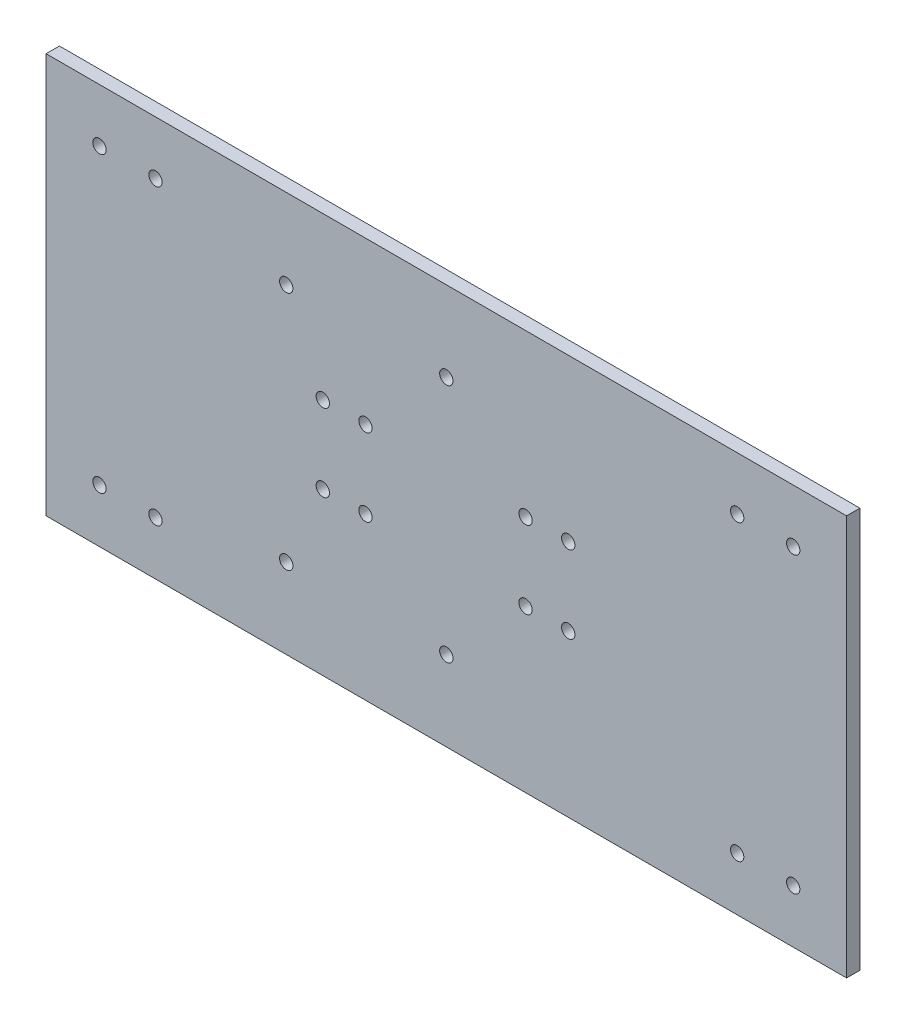
ISO-10303-21;
HEADER;
FILE_DESCRIPTION(('STEP AP214'),'2;1');
FILE_NAME('part.step','',(''),(''),'','','');
FILE_SCHEMA(('AUTOMOTIVE_DESIGN { 1 0 10303 214 1 1 1 1 }'));
ENDSEC;
DATA;
#1=APPLICATION_CONTEXT('core data for automotive mechanical design processes');
#2=APPLICATION_PROTOCOL_DEFINITION('international standard','automotive_design',2000,#1);
#3=PRODUCT_CONTEXT('',#1,'mechanical');
#4=PRODUCT('Part','Part','',(#3));
#5=PRODUCT_RELATED_PRODUCT_CATEGORY('part','',(#4));
#6=PRODUCT_DEFINITION_FORMATION('','',#4);
#7=PRODUCT_DEFINITION_CONTEXT('part definition',#1,'design');
#8=PRODUCT_DEFINITION('design','',#6,#7);
#9=PRODUCT_DEFINITION_SHAPE('','',#8);
#10=(LENGTH_UNIT() NAMED_UNIT(*) SI_UNIT(.MILLI.,.METRE.));
#11=(NAMED_UNIT(*) PLANE_ANGLE_UNIT() SI_UNIT($,.RADIAN.));
#12=(NAMED_UNIT(*) SI_UNIT($,.STERADIAN.) SOLID_ANGLE_UNIT());
#13=UNCERTAINTY_MEASURE_WITH_UNIT(LENGTH_MEASURE(1.E-05),#10,'distance_accuracy_value','');
#14=(GEOMETRIC_REPRESENTATION_CONTEXT(3) GLOBAL_UNCERTAINTY_ASSIGNED_CONTEXT((#13)) GLOBAL_UNIT_ASSIGNED_CONTEXT((#10,
#11,#12)) REPRESENTATION_CONTEXT('',''));
#15=CARTESIAN_POINT('',(0.,0.,0.));
#16=DIRECTION('',(0.,0.,1.));
#17=DIRECTION('',(1.,0.,0.));
#18=AXIS2_PLACEMENT_3D('',#15,#16,#17);
#19=CARTESIAN_POINT('',(0.,0.,5.));
#20=DIRECTION('',(0.,0.,-1.));
#21=DIRECTION('',(-1.,0.,0.));
#22=AXIS2_PLACEMENT_3D('',#19,#20,#21);
#23=PLANE('',#22);
#24=DIRECTION('',(0.,-1.,0.));
#25=VECTOR('',#24,1.);
#26=CARTESIAN_POINT('',(0.,0.,5.));
#27=LINE('',#26,#25);
#28=CARTESIAN_POINT('',(0.,150.,5.));
#29=VERTEX_POINT('',#28);
#30=CARTESIAN_POINT('',(0.,0.,5.));
#31=VERTEX_POINT('',#30);
#32=EDGE_CURVE('E85',#29,#31,#27,.T.);
#33=ORIENTED_EDGE('',*,*,#32,.T.);
#34=DIRECTION('',(1.,0.,0.));
#35=VECTOR('',#34,1.);
#36=CARTESIAN_POINT('',(0.,0.,5.));
#37=LINE('',#36,#35);
#38=CARTESIAN_POINT('',(300.,0.,5.));
#39=VERTEX_POINT('',#38);
#40=EDGE_CURVE('E80',#31,#39,#37,.T.);
#41=ORIENTED_EDGE('',*,*,#40,.T.);
#42=DIRECTION('',(0.,1.,0.));
#43=VECTOR('',#42,1.);
#44=CARTESIAN_POINT('',(300.,0.,5.));
#45=LINE('',#44,#43);
#46=CARTESIAN_POINT('',(300.,150.,5.));
#47=VERTEX_POINT('',#46);
#48=EDGE_CURVE('E83',#39,#47,#45,.T.);
#49=ORIENTED_EDGE('',*,*,#48,.T.);
#50=DIRECTION('',(-1.,0.,0.));
#51=VECTOR('',#50,1.);
#52=CARTESIAN_POINT('',(0.,150.,5.));
#53=LINE('',#52,#51);
#54=EDGE_CURVE('E50',#47,#29,#53,.T.);
#55=ORIENTED_EDGE('',*,*,#54,.T.);
#56=EDGE_LOOP('',(#33,#41,#49,#55));
#57=FACE_BOUND('',#56,.T.);
#58=CARTESIAN_POINT('',(150.,30.,5.));
#59=DIRECTION('',(0.,0.,1.));
#60=DIRECTION('',(1.,0.,0.));
#61=AXIS2_PLACEMENT_3D('',#58,#59,#60);
#62=CIRCLE('',#61,2.5);
#63=CARTESIAN_POINT('',(152.5,30.,5.));
#64=VERTEX_POINT('',#63);
#65=EDGE_CURVE('E100',#64,#64,#62,.T.);
#66=ORIENTED_EDGE('',*,*,#65,.F.);
#67=EDGE_LOOP('',(#66));
#68=FACE_BOUND('',#67,.T.);
#69=CARTESIAN_POINT('',(150.,120.,5.));
#70=DIRECTION('',(0.,0.,1.));
#71=DIRECTION('',(1.,0.,0.));
#72=AXIS2_PLACEMENT_3D('',#69,#70,#71);
#73=CIRCLE('',#72,2.5);
#74=CARTESIAN_POINT('',(152.5,120.,5.));
#75=VERTEX_POINT('',#74);
#76=EDGE_CURVE('E115',#75,#75,#73,.T.);
#77=ORIENTED_EDGE('',*,*,#76,.F.);
#78=EDGE_LOOP('',(#77));
#79=FACE_BOUND('',#78,.T.);
#80=CARTESIAN_POINT('',(103.7,89.5,5.));
#81=DIRECTION('',(0.,0.,1.));
#82=DIRECTION('',(1.,0.,0.));
#83=AXIS2_PLACEMENT_3D('',#80,#81,#82);
#84=CIRCLE('',#83,2.50000000000001);
#85=CARTESIAN_POINT('',(106.2,89.5,5.));
#86=VERTEX_POINT('',#85);
#87=EDGE_CURVE('E121',#86,#86,#84,.T.);
#88=ORIENTED_EDGE('',*,*,#87,.F.);
#89=EDGE_LOOP('',(#88));
#90=FACE_BOUND('',#89,.T.);
#91=CARTESIAN_POINT('',(103.7,60.5,5.));
#92=DIRECTION('',(0.,0.,1.));
#93=DIRECTION('',(1.,0.,0.));
#94=AXIS2_PLACEMENT_3D('',#91,#92,#93);
#95=CIRCLE('',#94,2.50000000000001);
#96=CARTESIAN_POINT('',(106.2,60.5,5.));
#97=VERTEX_POINT('',#96);
#98=EDGE_CURVE('E127',#97,#97,#95,.T.);
#99=ORIENTED_EDGE('',*,*,#98,.F.);
#100=EDGE_LOOP('',(#99));
#101=FACE_BOUND('',#100,.T.);
#102=CARTESIAN_POINT('',(119.7,89.5,5.));
#103=DIRECTION('',(0.,0.,1.));
#104=DIRECTION('',(1.,0.,0.));
#105=AXIS2_PLACEMENT_3D('',#102,#103,#104);
#106=CIRCLE('',#105,2.5);
#107=CARTESIAN_POINT('',(122.2,89.5,5.));
#108=VERTEX_POINT('',#107);
#109=EDGE_CURVE('E133',#108,#108,#106,.T.);
#110=ORIENTED_EDGE('',*,*,#109,.F.);
#111=EDGE_LOOP('',(#110));
#112=FACE_BOUND('',#111,.T.);
#113=CARTESIAN_POINT('',(119.7,60.5,5.));
#114=DIRECTION('',(0.,0.,1.));
#115=DIRECTION('',(1.,0.,0.));
#116=AXIS2_PLACEMENT_3D('',#113,#114,#115);
#117=CIRCLE('',#116,2.5);
#118=CARTESIAN_POINT('',(122.2,60.5,5.));
#119=VERTEX_POINT('',#118);
#120=EDGE_CURVE('E139',#119,#119,#117,.T.);
#121=ORIENTED_EDGE('',*,*,#120,.F.);
#122=EDGE_LOOP('',(#121));
#123=FACE_BOUND('',#122,.T.);
#124=CARTESIAN_POINT('',(90.,120.,5.));
#125=DIRECTION('',(0.,0.,1.));
#126=DIRECTION('',(1.,0.,0.));
#127=AXIS2_PLACEMENT_3D('',#124,#125,#126);
#128=CIRCLE('',#127,2.5);
#129=CARTESIAN_POINT('',(92.5,120.,5.));
#130=VERTEX_POINT('',#129);
#131=EDGE_CURVE('E145',#130,#130,#128,.T.);
#132=ORIENTED_EDGE('',*,*,#131,.F.);
#133=EDGE_LOOP('',(#132));
#134=FACE_BOUND('',#133,.T.);
#135=CARTESIAN_POINT('',(90.,30.,5.));
#136=DIRECTION('',(0.,0.,1.));
#137=DIRECTION('',(1.,0.,0.));
#138=AXIS2_PLACEMENT_3D('',#135,#136,#137);
#139=CIRCLE('',#138,2.5);
#140=CARTESIAN_POINT('',(92.5,30.,5.));
#141=VERTEX_POINT('',#140);
#142=EDGE_CURVE('E151',#141,#141,#139,.T.);
#143=ORIENTED_EDGE('',*,*,#142,.F.);
#144=EDGE_LOOP('',(#143));
#145=FACE_BOUND('',#144,.T.);
#146=CARTESIAN_POINT('',(179.7,89.5,5.));
#147=DIRECTION('',(0.,0.,1.));
#148=DIRECTION('',(1.,0.,0.));
#149=AXIS2_PLACEMENT_3D('',#146,#147,#148);
#150=CIRCLE('',#149,2.50000000000002);
#151=CARTESIAN_POINT('',(182.2,89.5,5.));
#152=VERTEX_POINT('',#151);
#153=EDGE_CURVE('E157',#152,#152,#150,.T.);
#154=ORIENTED_EDGE('',*,*,#153,.F.);
#155=EDGE_LOOP('',(#154));
#156=FACE_BOUND('',#155,.T.);
#157=CARTESIAN_POINT('',(195.7,60.5,5.));
#158=DIRECTION('',(0.,0.,1.));
#159=DIRECTION('',(1.,0.,0.));
#160=AXIS2_PLACEMENT_3D('',#157,#158,#159);
#161=CIRCLE('',#160,2.5);
#162=CARTESIAN_POINT('',(198.2,60.5,5.));
#163=VERTEX_POINT('',#162);
#164=EDGE_CURVE('E163',#163,#163,#161,.T.);
#165=ORIENTED_EDGE('',*,*,#164,.F.);
#166=EDGE_LOOP('',(#165));
#167=FACE_BOUND('',#166,.T.);
#168=CARTESIAN_POINT('',(195.7,89.5,5.));
#169=DIRECTION('',(0.,0.,1.));
#170=DIRECTION('',(1.,0.,0.));
#171=AXIS2_PLACEMENT_3D('',#168,#169,#170);
#172=CIRCLE('',#171,2.49999999999997);
#173=CARTESIAN_POINT('',(198.2,89.5,5.));
#174=VERTEX_POINT('',#173);
#175=EDGE_CURVE('E169',#174,#174,#172,.T.);
#176=ORIENTED_EDGE('',*,*,#175,.F.);
#177=EDGE_LOOP('',(#176));
#178=FACE_BOUND('',#177,.T.);
#179=CARTESIAN_POINT('',(179.7,60.5,5.));
#180=DIRECTION('',(0.,0.,1.));
#181=DIRECTION('',(1.,0.,0.));
#182=AXIS2_PLACEMENT_3D('',#179,#180,#181);
#183=CIRCLE('',#182,2.50000000000002);
#184=CARTESIAN_POINT('',(182.2,60.5,5.));
#185=VERTEX_POINT('',#184);
#186=EDGE_CURVE('E175',#185,#185,#183,.T.);
#187=ORIENTED_EDGE('',*,*,#186,.F.);
#188=EDGE_LOOP('',(#187));
#189=FACE_BOUND('',#188,.T.);
#190=CARTESIAN_POINT('',(20.,130.,5.));
#191=DIRECTION('',(0.,0.,1.));
#192=DIRECTION('',(1.,0.,0.));
#193=AXIS2_PLACEMENT_3D('',#190,#191,#192);
#194=CIRCLE('',#193,2.5);
#195=CARTESIAN_POINT('',(22.5,130.,5.));
#196=VERTEX_POINT('',#195);
#197=EDGE_CURVE('E181',#196,#196,#194,.T.);
#198=ORIENTED_EDGE('',*,*,#197,.F.);
#199=EDGE_LOOP('',(#198));
#200=FACE_BOUND('',#199,.T.);
#201=CARTESIAN_POINT('',(41.,130.,5.));
#202=DIRECTION('',(0.,0.,1.));
#203=DIRECTION('',(1.,0.,0.));
#204=AXIS2_PLACEMENT_3D('',#201,#202,#203);
#205=CIRCLE('',#204,2.5);
#206=CARTESIAN_POINT('',(43.5,130.,5.));
#207=VERTEX_POINT('',#206);
#208=EDGE_CURVE('E187',#207,#207,#205,.T.);
#209=ORIENTED_EDGE('',*,*,#208,.F.);
#210=EDGE_LOOP('',(#209));
#211=FACE_BOUND('',#210,.T.);
#212=CARTESIAN_POINT('',(259.,130.,5.));
#213=DIRECTION('',(0.,0.,1.));
#214=DIRECTION('',(1.,0.,0.));
#215=AXIS2_PLACEMENT_3D('',#212,#213,#214);
#216=CIRCLE('',#215,2.50000000000002);
#217=CARTESIAN_POINT('',(261.5,130.,5.));
#218=VERTEX_POINT('',#217);
#219=EDGE_CURVE('E193',#218,#218,#216,.T.);
#220=ORIENTED_EDGE('',*,*,#219,.F.);
#221=EDGE_LOOP('',(#220));
#222=FACE_BOUND('',#221,.T.);
#223=CARTESIAN_POINT('',(280.,130.,5.));
#224=DIRECTION('',(0.,0.,1.));
#225=DIRECTION('',(1.,0.,0.));
#226=AXIS2_PLACEMENT_3D('',#223,#224,#225);
#227=CIRCLE('',#226,2.49999999999997);
#228=CARTESIAN_POINT('',(282.5,130.,5.));
#229=VERTEX_POINT('',#228);
#230=EDGE_CURVE('E199',#229,#229,#227,.T.);
#231=ORIENTED_EDGE('',*,*,#230,.F.);
#232=EDGE_LOOP('',(#231));
#233=FACE_BOUND('',#232,.T.);
#234=CARTESIAN_POINT('',(259.000000000001,20.,5.));
#235=DIRECTION('',(0.,0.,1.));
#236=DIRECTION('',(1.,0.,0.));
#237=AXIS2_PLACEMENT_3D('',#234,#235,#236);
#238=CIRCLE('',#237,2.49999999999997);
#239=CARTESIAN_POINT('',(261.500000000001,20.,5.));
#240=VERTEX_POINT('',#239);
#241=EDGE_CURVE('E205',#240,#240,#238,.T.);
#242=ORIENTED_EDGE('',*,*,#241,.F.);
#243=EDGE_LOOP('',(#242));
#244=FACE_BOUND('',#243,.T.);
#245=CARTESIAN_POINT('',(280.000000000001,20.,5.));
#246=DIRECTION('',(0.,0.,1.));
#247=DIRECTION('',(1.,0.,0.));
#248=AXIS2_PLACEMENT_3D('',#245,#246,#247);
#249=CIRCLE('',#248,2.50000000000002);
#250=CARTESIAN_POINT('',(282.500000000001,20.,5.));
#251=VERTEX_POINT('',#250);
#252=EDGE_CURVE('E211',#251,#251,#249,.T.);
#253=ORIENTED_EDGE('',*,*,#252,.F.);
#254=EDGE_LOOP('',(#253));
#255=FACE_BOUND('',#254,.T.);
#256=CARTESIAN_POINT('',(20.0000000000011,20.,5.));
#257=DIRECTION('',(0.,0.,1.));
#258=DIRECTION('',(1.,0.,0.));
#259=AXIS2_PLACEMENT_3D('',#256,#257,#258);
#260=CIRCLE('',#259,2.5);
#261=CARTESIAN_POINT('',(22.5000000000011,20.,5.));
#262=VERTEX_POINT('',#261);
#263=EDGE_CURVE('E217',#262,#262,#260,.T.);
#264=ORIENTED_EDGE('',*,*,#263,.F.);
#265=EDGE_LOOP('',(#264));
#266=FACE_BOUND('',#265,.T.);
#267=CARTESIAN_POINT('',(41.0000000000011,20.,5.));
#268=DIRECTION('',(0.,0.,1.));
#269=DIRECTION('',(1.,0.,0.));
#270=AXIS2_PLACEMENT_3D('',#267,#268,#269);
#271=CIRCLE('',#270,2.5);
#272=CARTESIAN_POINT('',(43.5000000000011,20.,5.));
#273=VERTEX_POINT('',#272);
#274=EDGE_CURVE('E223',#273,#273,#271,.T.);
#275=ORIENTED_EDGE('',*,*,#274,.F.);
#276=EDGE_LOOP('',(#275));
#277=FACE_BOUND('',#276,.T.);
#278=ADVANCED_FACE('F33',(#57,#68,#79,#90,#101,#112,#123,#134,#145,#156,#167,#178,#189,#200,
#211,#222,#233,#244,#255,#266,#277),#23,.F.);
#279=CARTESIAN_POINT('',(0.,0.,0.));
#280=DIRECTION('',(0.,0.,-1.));
#281=DIRECTION('',(-1.,0.,0.));
#282=AXIS2_PLACEMENT_3D('',#279,#280,#281);
#283=PLANE('',#282);
#284=CARTESIAN_POINT('',(20.0000000000011,20.,0.));
#285=DIRECTION('',(0.,0.,1.));
#286=DIRECTION('',(1.,0.,0.));
#287=AXIS2_PLACEMENT_3D('',#284,#285,#286);
#288=CIRCLE('',#287,2.5);
#289=CARTESIAN_POINT('',(22.5000000000011,20.,0.));
#290=VERTEX_POINT('',#289);
#291=EDGE_CURVE('E220',#290,#290,#288,.T.);
#292=ORIENTED_EDGE('',*,*,#291,.T.);
#293=EDGE_LOOP('',(#292));
#294=FACE_BOUND('',#293,.T.);
#295=CARTESIAN_POINT('',(259.000000000001,20.,0.));
#296=DIRECTION('',(0.,0.,1.));
#297=DIRECTION('',(1.,0.,0.));
#298=AXIS2_PLACEMENT_3D('',#295,#296,#297);
#299=CIRCLE('',#298,2.49999999999997);
#300=CARTESIAN_POINT('',(261.500000000001,20.,0.));
#301=VERTEX_POINT('',#300);
#302=EDGE_CURVE('E208',#301,#301,#299,.T.);
#303=ORIENTED_EDGE('',*,*,#302,.T.);
#304=EDGE_LOOP('',(#303));
#305=FACE_BOUND('',#304,.T.);
#306=CARTESIAN_POINT('',(259.,130.,0.));
#307=DIRECTION('',(0.,0.,1.));
#308=DIRECTION('',(1.,0.,0.));
#309=AXIS2_PLACEMENT_3D('',#306,#307,#308);
#310=CIRCLE('',#309,2.50000000000002);
#311=CARTESIAN_POINT('',(261.5,130.,0.));
#312=VERTEX_POINT('',#311);
#313=EDGE_CURVE('E196',#312,#312,#310,.T.);
#314=ORIENTED_EDGE('',*,*,#313,.T.);
#315=EDGE_LOOP('',(#314));
#316=FACE_BOUND('',#315,.T.);
#317=CARTESIAN_POINT('',(20.,130.,0.));
#318=DIRECTION('',(0.,0.,1.));
#319=DIRECTION('',(1.,0.,0.));
#320=AXIS2_PLACEMENT_3D('',#317,#318,#319);
#321=CIRCLE('',#320,2.5);
#322=CARTESIAN_POINT('',(22.5,130.,0.));
#323=VERTEX_POINT('',#322);
#324=EDGE_CURVE('E184',#323,#323,#321,.T.);
#325=ORIENTED_EDGE('',*,*,#324,.T.);
#326=EDGE_LOOP('',(#325));
#327=FACE_BOUND('',#326,.T.);
#328=CARTESIAN_POINT('',(195.7,89.5,0.));
#329=DIRECTION('',(0.,0.,1.));
#330=DIRECTION('',(1.,0.,0.));
#331=AXIS2_PLACEMENT_3D('',#328,#329,#330);
#332=CIRCLE('',#331,2.49999999999997);
#333=CARTESIAN_POINT('',(198.2,89.5,0.));
#334=VERTEX_POINT('',#333);
#335=EDGE_CURVE('E172',#334,#334,#332,.T.);
#336=ORIENTED_EDGE('',*,*,#335,.T.);
#337=EDGE_LOOP('',(#336));
#338=FACE_BOUND('',#337,.T.);
#339=CARTESIAN_POINT('',(179.7,89.5,0.));
#340=DIRECTION('',(0.,0.,1.));
#341=DIRECTION('',(1.,0.,0.));
#342=AXIS2_PLACEMENT_3D('',#339,#340,#341);
#343=CIRCLE('',#342,2.50000000000002);
#344=CARTESIAN_POINT('',(182.2,89.5,0.));
#345=VERTEX_POINT('',#344);
#346=EDGE_CURVE('E160',#345,#345,#343,.T.);
#347=ORIENTED_EDGE('',*,*,#346,.T.);
#348=EDGE_LOOP('',(#347));
#349=FACE_BOUND('',#348,.T.);
#350=CARTESIAN_POINT('',(90.,120.,0.));
#351=DIRECTION('',(0.,0.,1.));
#352=DIRECTION('',(1.,0.,0.));
#353=AXIS2_PLACEMENT_3D('',#350,#351,#352);
#354=CIRCLE('',#353,2.5);
#355=CARTESIAN_POINT('',(92.5,120.,0.));
#356=VERTEX_POINT('',#355);
#357=EDGE_CURVE('E148',#356,#356,#354,.T.);
#358=ORIENTED_EDGE('',*,*,#357,.T.);
#359=EDGE_LOOP('',(#358));
#360=FACE_BOUND('',#359,.T.);
#361=CARTESIAN_POINT('',(119.7,89.5,0.));
#362=DIRECTION('',(0.,0.,1.));
#363=DIRECTION('',(1.,0.,0.));
#364=AXIS2_PLACEMENT_3D('',#361,#362,#363);
#365=CIRCLE('',#364,2.5);
#366=CARTESIAN_POINT('',(122.2,89.5,0.));
#367=VERTEX_POINT('',#366);
#368=EDGE_CURVE('E136',#367,#367,#365,.T.);
#369=ORIENTED_EDGE('',*,*,#368,.T.);
#370=EDGE_LOOP('',(#369));
#371=FACE_BOUND('',#370,.T.);
#372=CARTESIAN_POINT('',(103.7,89.5,0.));
#373=DIRECTION('',(0.,0.,1.));
#374=DIRECTION('',(1.,0.,0.));
#375=AXIS2_PLACEMENT_3D('',#372,#373,#374);
#376=CIRCLE('',#375,2.50000000000001);
#377=CARTESIAN_POINT('',(106.2,89.5,0.));
#378=VERTEX_POINT('',#377);
#379=EDGE_CURVE('E124',#378,#378,#376,.T.);
#380=ORIENTED_EDGE('',*,*,#379,.T.);
#381=EDGE_LOOP('',(#380));
#382=FACE_BOUND('',#381,.T.);
#383=CARTESIAN_POINT('',(150.,30.,0.));
#384=DIRECTION('',(0.,0.,1.));
#385=DIRECTION('',(1.,0.,0.));
#386=AXIS2_PLACEMENT_3D('',#383,#384,#385);
#387=CIRCLE('',#386,2.5);
#388=CARTESIAN_POINT('',(152.5,30.,0.));
#389=VERTEX_POINT('',#388);
#390=EDGE_CURVE('E112',#389,#389,#387,.T.);
#391=ORIENTED_EDGE('',*,*,#390,.T.);
#392=EDGE_LOOP('',(#391));
#393=FACE_BOUND('',#392,.T.);
#394=DIRECTION('',(0.,-1.,0.));
#395=VECTOR('',#394,1.);
#396=CARTESIAN_POINT('',(0.,0.,0.));
#397=LINE('',#396,#395);
#398=CARTESIAN_POINT('',(0.,150.,0.));
#399=VERTEX_POINT('',#398);
#400=CARTESIAN_POINT('',(0.,0.,0.));
#401=VERTEX_POINT('',#400);
#402=EDGE_CURVE('E97',#399,#401,#397,.T.);
#403=ORIENTED_EDGE('',*,*,#402,.F.);
#404=DIRECTION('',(-1.,0.,0.));
#405=VECTOR('',#404,1.);
#406=CARTESIAN_POINT('',(0.,150.,0.));
#407=LINE('',#406,#405);
#408=CARTESIAN_POINT('',(300.,150.,0.));
#409=VERTEX_POINT('',#408);
#410=EDGE_CURVE('E73',#409,#399,#407,.T.);
#411=ORIENTED_EDGE('',*,*,#410,.F.);
#412=DIRECTION('',(0.,1.,0.));
#413=VECTOR('',#412,1.);
#414=CARTESIAN_POINT('',(300.,0.,0.));
#415=LINE('',#414,#413);
#416=CARTESIAN_POINT('',(300.,0.,0.));
#417=VERTEX_POINT('',#416);
#418=EDGE_CURVE('E67',#417,#409,#415,.T.);
#419=ORIENTED_EDGE('',*,*,#418,.F.);
#420=DIRECTION('',(1.,0.,0.));
#421=VECTOR('',#420,1.);
#422=CARTESIAN_POINT('',(0.,0.,0.));
#423=LINE('',#422,#421);
#424=EDGE_CURVE('E89',#401,#417,#423,.T.);
#425=ORIENTED_EDGE('',*,*,#424,.F.);
#426=EDGE_LOOP('',(#403,#411,#419,#425));
#427=FACE_BOUND('',#426,.T.);
#428=CARTESIAN_POINT('',(150.,120.,0.));
#429=DIRECTION('',(0.,0.,1.));
#430=DIRECTION('',(1.,0.,0.));
#431=AXIS2_PLACEMENT_3D('',#428,#429,#430);
#432=CIRCLE('',#431,2.5);
#433=CARTESIAN_POINT('',(152.5,120.,0.));
#434=VERTEX_POINT('',#433);
#435=EDGE_CURVE('E118',#434,#434,#432,.T.);
#436=ORIENTED_EDGE('',*,*,#435,.T.);
#437=EDGE_LOOP('',(#436));
#438=FACE_BOUND('',#437,.T.);
#439=CARTESIAN_POINT('',(103.7,60.5,0.));
#440=DIRECTION('',(0.,0.,1.));
#441=DIRECTION('',(1.,0.,0.));
#442=AXIS2_PLACEMENT_3D('',#439,#440,#441);
#443=CIRCLE('',#442,2.50000000000001);
#444=CARTESIAN_POINT('',(106.2,60.5,0.));
#445=VERTEX_POINT('',#444);
#446=EDGE_CURVE('E130',#445,#445,#443,.T.);
#447=ORIENTED_EDGE('',*,*,#446,.T.);
#448=EDGE_LOOP('',(#447));
#449=FACE_BOUND('',#448,.T.);
#450=CARTESIAN_POINT('',(119.7,60.5,0.));
#451=DIRECTION('',(0.,0.,1.));
#452=DIRECTION('',(1.,0.,0.));
#453=AXIS2_PLACEMENT_3D('',#450,#451,#452);
#454=CIRCLE('',#453,2.5);
#455=CARTESIAN_POINT('',(122.2,60.5,0.));
#456=VERTEX_POINT('',#455);
#457=EDGE_CURVE('E142',#456,#456,#454,.T.);
#458=ORIENTED_EDGE('',*,*,#457,.T.);
#459=EDGE_LOOP('',(#458));
#460=FACE_BOUND('',#459,.T.);
#461=CARTESIAN_POINT('',(90.,30.,0.));
#462=DIRECTION('',(0.,0.,1.));
#463=DIRECTION('',(1.,0.,0.));
#464=AXIS2_PLACEMENT_3D('',#461,#462,#463);
#465=CIRCLE('',#464,2.5);
#466=CARTESIAN_POINT('',(92.5,30.,0.));
#467=VERTEX_POINT('',#466);
#468=EDGE_CURVE('E154',#467,#467,#465,.T.);
#469=ORIENTED_EDGE('',*,*,#468,.T.);
#470=EDGE_LOOP('',(#469));
#471=FACE_BOUND('',#470,.T.);
#472=CARTESIAN_POINT('',(195.7,60.5,0.));
#473=DIRECTION('',(0.,0.,1.));
#474=DIRECTION('',(1.,0.,0.));
#475=AXIS2_PLACEMENT_3D('',#472,#473,#474);
#476=CIRCLE('',#475,2.5);
#477=CARTESIAN_POINT('',(198.2,60.5,0.));
#478=VERTEX_POINT('',#477);
#479=EDGE_CURVE('E166',#478,#478,#476,.T.);
#480=ORIENTED_EDGE('',*,*,#479,.T.);
#481=EDGE_LOOP('',(#480));
#482=FACE_BOUND('',#481,.T.);
#483=CARTESIAN_POINT('',(179.7,60.5,0.));
#484=DIRECTION('',(0.,0.,1.));
#485=DIRECTION('',(1.,0.,0.));
#486=AXIS2_PLACEMENT_3D('',#483,#484,#485);
#487=CIRCLE('',#486,2.50000000000002);
#488=CARTESIAN_POINT('',(182.2,60.5,0.));
#489=VERTEX_POINT('',#488);
#490=EDGE_CURVE('E178',#489,#489,#487,.T.);
#491=ORIENTED_EDGE('',*,*,#490,.T.);
#492=EDGE_LOOP('',(#491));
#493=FACE_BOUND('',#492,.T.);
#494=CARTESIAN_POINT('',(41.,130.,0.));
#495=DIRECTION('',(0.,0.,1.));
#496=DIRECTION('',(1.,0.,0.));
#497=AXIS2_PLACEMENT_3D('',#494,#495,#496);
#498=CIRCLE('',#497,2.5);
#499=CARTESIAN_POINT('',(43.5,130.,0.));
#500=VERTEX_POINT('',#499);
#501=EDGE_CURVE('E190',#500,#500,#498,.T.);
#502=ORIENTED_EDGE('',*,*,#501,.T.);
#503=EDGE_LOOP('',(#502));
#504=FACE_BOUND('',#503,.T.);
#505=CARTESIAN_POINT('',(280.,130.,0.));
#506=DIRECTION('',(0.,0.,1.));
#507=DIRECTION('',(1.,0.,0.));
#508=AXIS2_PLACEMENT_3D('',#505,#506,#507);
#509=CIRCLE('',#508,2.49999999999997);
#510=CARTESIAN_POINT('',(282.5,130.,0.));
#511=VERTEX_POINT('',#510);
#512=EDGE_CURVE('E202',#511,#511,#509,.T.);
#513=ORIENTED_EDGE('',*,*,#512,.T.);
#514=EDGE_LOOP('',(#513));
#515=FACE_BOUND('',#514,.T.);
#516=CARTESIAN_POINT('',(280.000000000001,20.,0.));
#517=DIRECTION('',(0.,0.,1.));
#518=DIRECTION('',(1.,0.,0.));
#519=AXIS2_PLACEMENT_3D('',#516,#517,#518);
#520=CIRCLE('',#519,2.50000000000002);
#521=CARTESIAN_POINT('',(282.500000000001,20.,0.));
#522=VERTEX_POINT('',#521);
#523=EDGE_CURVE('E214',#522,#522,#520,.T.);
#524=ORIENTED_EDGE('',*,*,#523,.T.);
#525=EDGE_LOOP('',(#524));
#526=FACE_BOUND('',#525,.T.);
#527=CARTESIAN_POINT('',(41.0000000000011,20.,0.));
#528=DIRECTION('',(0.,0.,1.));
#529=DIRECTION('',(1.,0.,0.));
#530=AXIS2_PLACEMENT_3D('',#527,#528,#529);
#531=CIRCLE('',#530,2.5);
#532=CARTESIAN_POINT('',(43.5000000000011,20.,0.));
#533=VERTEX_POINT('',#532);
#534=EDGE_CURVE('E226',#533,#533,#531,.T.);
#535=ORIENTED_EDGE('',*,*,#534,.T.);
#536=EDGE_LOOP('',(#535));
#537=FACE_BOUND('',#536,.T.);
#538=ADVANCED_FACE('F108',(#294,#305,#316,#327,#338,#349,#360,#371,#382,#393,#427,#438,#449,
#460,#471,#482,#493,#504,#515,#526,#537),#283,.T.);
#539=CARTESIAN_POINT('',(0.,0.,5.));
#540=DIRECTION('',(1.,0.,0.));
#541=DIRECTION('',(0.,1.,0.));
#542=AXIS2_PLACEMENT_3D('',#539,#540,#541);
#543=PLANE('',#542);
#544=ORIENTED_EDGE('',*,*,#402,.T.);
#545=DIRECTION('',(0.,0.,-1.));
#546=VECTOR('',#545,1.);
#547=CARTESIAN_POINT('',(0.,0.,5.));
#548=LINE('',#547,#546);
#549=EDGE_CURVE('E11',#31,#401,#548,.T.);
#550=ORIENTED_EDGE('',*,*,#549,.F.);
#551=ORIENTED_EDGE('',*,*,#32,.F.);
#552=DIRECTION('',(0.,0.,-1.));
#553=VECTOR('',#552,1.);
#554=CARTESIAN_POINT('',(0.,150.,5.));
#555=LINE('',#554,#553);
#556=EDGE_CURVE('E93',#29,#399,#555,.T.);
#557=ORIENTED_EDGE('',*,*,#556,.T.);
#558=EDGE_LOOP('',(#544,#550,#551,#557));
#559=FACE_BOUND('',#558,.T.);
#560=ADVANCED_FACE('F35',(#559),#543,.F.);
#561=CARTESIAN_POINT('',(0.,0.,5.));
#562=DIRECTION('',(0.,1.,0.));
#563=DIRECTION('',(0.,0.,1.));
#564=AXIS2_PLACEMENT_3D('',#561,#562,#563);
#565=PLANE('',#564);
#566=ORIENTED_EDGE('',*,*,#424,.T.);
#567=DIRECTION('',(0.,0.,-1.));
#568=VECTOR('',#567,1.);
#569=CARTESIAN_POINT('',(300.,0.,5.));
#570=LINE('',#569,#568);
#571=EDGE_CURVE('E42',#39,#417,#570,.T.);
#572=ORIENTED_EDGE('',*,*,#571,.F.);
#573=ORIENTED_EDGE('',*,*,#40,.F.);
#574=ORIENTED_EDGE('',*,*,#549,.T.);
#575=EDGE_LOOP('',(#566,#572,#573,#574));
#576=FACE_BOUND('',#575,.T.);
#577=ADVANCED_FACE('F88',(#576),#565,.F.);
#578=CARTESIAN_POINT('',(300.,0.,5.));
#579=DIRECTION('',(-1.,0.,0.));
#580=DIRECTION('',(0.,0.,1.));
#581=AXIS2_PLACEMENT_3D('',#578,#579,#580);
#582=PLANE('',#581);
#583=ORIENTED_EDGE('',*,*,#418,.T.);
#584=DIRECTION('',(0.,0.,-1.));
#585=VECTOR('',#584,1.);
#586=CARTESIAN_POINT('',(300.,150.,5.));
#587=LINE('',#586,#585);
#588=EDGE_CURVE('E90',#47,#409,#587,.T.);
#589=ORIENTED_EDGE('',*,*,#588,.F.);
#590=ORIENTED_EDGE('',*,*,#48,.F.);
#591=ORIENTED_EDGE('',*,*,#571,.T.);
#592=EDGE_LOOP('',(#583,#589,#590,#591));
#593=FACE_BOUND('',#592,.T.);
#594=ADVANCED_FACE('F91',(#593),#582,.F.);
#595=CARTESIAN_POINT('',(0.,150.,5.));
#596=DIRECTION('',(0.,-1.,0.));
#597=DIRECTION('',(0.,0.,-1.));
#598=AXIS2_PLACEMENT_3D('',#595,#596,#597);
#599=PLANE('',#598);
#600=ORIENTED_EDGE('',*,*,#410,.T.);
#601=ORIENTED_EDGE('',*,*,#556,.F.);
#602=ORIENTED_EDGE('',*,*,#54,.F.);
#603=ORIENTED_EDGE('',*,*,#588,.T.);
#604=EDGE_LOOP('',(#600,#601,#602,#603));
#605=FACE_BOUND('',#604,.T.);
#606=ADVANCED_FACE('F105',(#605),#599,.F.);
#607=CARTESIAN_POINT('',(150.,30.,5.));
#608=DIRECTION('',(0.,0.,-1.));
#609=DIRECTION('',(-1.,0.,0.));
#610=AXIS2_PLACEMENT_3D('',#607,#608,#609);
#611=CYLINDRICAL_SURFACE('',#610,2.5);
#612=ORIENTED_EDGE('',*,*,#65,.T.);
#613=EDGE_LOOP('',(#612));
#614=FACE_BOUND('',#613,.T.);
#615=ORIENTED_EDGE('',*,*,#390,.F.);
#616=EDGE_LOOP('',(#615));
#617=FACE_BOUND('',#616,.T.);
#618=ADVANCED_FACE('F243',(#614,#617),#611,.F.);
#619=CARTESIAN_POINT('',(150.,120.,5.));
#620=DIRECTION('',(0.,0.,-1.));
#621=DIRECTION('',(-1.,0.,0.));
#622=AXIS2_PLACEMENT_3D('',#619,#620,#621);
#623=CYLINDRICAL_SURFACE('',#622,2.5);
#624=ORIENTED_EDGE('',*,*,#76,.T.);
#625=EDGE_LOOP('',(#624));
#626=FACE_BOUND('',#625,.T.);
#627=ORIENTED_EDGE('',*,*,#435,.F.);
#628=EDGE_LOOP('',(#627));
#629=FACE_BOUND('',#628,.T.);
#630=ADVANCED_FACE('F289',(#626,#629),#623,.F.);
#631=CARTESIAN_POINT('',(103.7,89.5,5.));
#632=DIRECTION('',(0.,0.,-1.));
#633=DIRECTION('',(-1.,0.,0.));
#634=AXIS2_PLACEMENT_3D('',#631,#632,#633);
#635=CYLINDRICAL_SURFACE('',#634,2.50000000000001);
#636=ORIENTED_EDGE('',*,*,#87,.T.);
#637=EDGE_LOOP('',(#636));
#638=FACE_BOUND('',#637,.T.);
#639=ORIENTED_EDGE('',*,*,#379,.F.);
#640=EDGE_LOOP('',(#639));
#641=FACE_BOUND('',#640,.T.);
#642=ADVANCED_FACE('F297',(#638,#641),#635,.F.);
#643=CARTESIAN_POINT('',(103.7,60.5,5.));
#644=DIRECTION('',(0.,0.,-1.));
#645=DIRECTION('',(-1.,0.,0.));
#646=AXIS2_PLACEMENT_3D('',#643,#644,#645);
#647=CYLINDRICAL_SURFACE('',#646,2.50000000000001);
#648=ORIENTED_EDGE('',*,*,#98,.T.);
#649=EDGE_LOOP('',(#648));
#650=FACE_BOUND('',#649,.T.);
#651=ORIENTED_EDGE('',*,*,#446,.F.);
#652=EDGE_LOOP('',(#651));
#653=FACE_BOUND('',#652,.T.);
#654=ADVANCED_FACE('F305',(#650,#653),#647,.F.);
#655=CARTESIAN_POINT('',(119.7,89.5,5.));
#656=DIRECTION('',(0.,0.,-1.));
#657=DIRECTION('',(-1.,0.,0.));
#658=AXIS2_PLACEMENT_3D('',#655,#656,#657);
#659=CYLINDRICAL_SURFACE('',#658,2.5);
#660=ORIENTED_EDGE('',*,*,#109,.T.);
#661=EDGE_LOOP('',(#660));
#662=FACE_BOUND('',#661,.T.);
#663=ORIENTED_EDGE('',*,*,#368,.F.);
#664=EDGE_LOOP('',(#663));
#665=FACE_BOUND('',#664,.T.);
#666=ADVANCED_FACE('F314',(#662,#665),#659,.F.);
#667=CARTESIAN_POINT('',(119.7,60.5,5.));
#668=DIRECTION('',(0.,0.,-1.));
#669=DIRECTION('',(-1.,0.,0.));
#670=AXIS2_PLACEMENT_3D('',#667,#668,#669);
#671=CYLINDRICAL_SURFACE('',#670,2.5);
#672=ORIENTED_EDGE('',*,*,#120,.T.);
#673=EDGE_LOOP('',(#672));
#674=FACE_BOUND('',#673,.T.);
#675=ORIENTED_EDGE('',*,*,#457,.F.);
#676=EDGE_LOOP('',(#675));
#677=FACE_BOUND('',#676,.T.);
#678=ADVANCED_FACE('F323',(#674,#677),#671,.F.);
#679=CARTESIAN_POINT('',(90.,120.,5.));
#680=DIRECTION('',(0.,0.,-1.));
#681=DIRECTION('',(-1.,0.,0.));
#682=AXIS2_PLACEMENT_3D('',#679,#680,#681);
#683=CYLINDRICAL_SURFACE('',#682,2.5);
#684=ORIENTED_EDGE('',*,*,#131,.T.);
#685=EDGE_LOOP('',(#684));
#686=FACE_BOUND('',#685,.T.);
#687=ORIENTED_EDGE('',*,*,#357,.F.);
#688=EDGE_LOOP('',(#687));
#689=FACE_BOUND('',#688,.T.);
#690=ADVANCED_FACE('F332',(#686,#689),#683,.F.);
#691=CARTESIAN_POINT('',(90.,30.,5.));
#692=DIRECTION('',(0.,0.,-1.));
#693=DIRECTION('',(-1.,0.,0.));
#694=AXIS2_PLACEMENT_3D('',#691,#692,#693);
#695=CYLINDRICAL_SURFACE('',#694,2.5);
#696=ORIENTED_EDGE('',*,*,#142,.T.);
#697=EDGE_LOOP('',(#696));
#698=FACE_BOUND('',#697,.T.);
#699=ORIENTED_EDGE('',*,*,#468,.F.);
#700=EDGE_LOOP('',(#699));
#701=FACE_BOUND('',#700,.T.);
#702=ADVANCED_FACE('F341',(#698,#701),#695,.F.);
#703=CARTESIAN_POINT('',(179.7,89.5,5.));
#704=DIRECTION('',(0.,0.,-1.));
#705=DIRECTION('',(-1.,0.,0.));
#706=AXIS2_PLACEMENT_3D('',#703,#704,#705);
#707=CYLINDRICAL_SURFACE('',#706,2.50000000000002);
#708=ORIENTED_EDGE('',*,*,#153,.T.);
#709=EDGE_LOOP('',(#708));
#710=FACE_BOUND('',#709,.T.);
#711=ORIENTED_EDGE('',*,*,#346,.F.);
#712=EDGE_LOOP('',(#711));
#713=FACE_BOUND('',#712,.T.);
#714=ADVANCED_FACE('F350',(#710,#713),#707,.F.);
#715=CARTESIAN_POINT('',(195.7,60.5,5.));
#716=DIRECTION('',(0.,0.,-1.));
#717=DIRECTION('',(-1.,0.,0.));
#718=AXIS2_PLACEMENT_3D('',#715,#716,#717);
#719=CYLINDRICAL_SURFACE('',#718,2.5);
#720=ORIENTED_EDGE('',*,*,#164,.T.);
#721=EDGE_LOOP('',(#720));
#722=FACE_BOUND('',#721,.T.);
#723=ORIENTED_EDGE('',*,*,#479,.F.);
#724=EDGE_LOOP('',(#723));
#725=FACE_BOUND('',#724,.T.);
#726=ADVANCED_FACE('F359',(#722,#725),#719,.F.);
#727=CARTESIAN_POINT('',(195.7,89.5,5.));
#728=DIRECTION('',(0.,0.,-1.));
#729=DIRECTION('',(-1.,0.,0.));
#730=AXIS2_PLACEMENT_3D('',#727,#728,#729);
#731=CYLINDRICAL_SURFACE('',#730,2.49999999999997);
#732=ORIENTED_EDGE('',*,*,#175,.T.);
#733=EDGE_LOOP('',(#732));
#734=FACE_BOUND('',#733,.T.);
#735=ORIENTED_EDGE('',*,*,#335,.F.);
#736=EDGE_LOOP('',(#735));
#737=FACE_BOUND('',#736,.T.);
#738=ADVANCED_FACE('F368',(#734,#737),#731,.F.);
#739=CARTESIAN_POINT('',(179.7,60.5,5.));
#740=DIRECTION('',(0.,0.,-1.));
#741=DIRECTION('',(-1.,0.,0.));
#742=AXIS2_PLACEMENT_3D('',#739,#740,#741);
#743=CYLINDRICAL_SURFACE('',#742,2.50000000000002);
#744=ORIENTED_EDGE('',*,*,#186,.T.);
#745=EDGE_LOOP('',(#744));
#746=FACE_BOUND('',#745,.T.);
#747=ORIENTED_EDGE('',*,*,#490,.F.);
#748=EDGE_LOOP('',(#747));
#749=FACE_BOUND('',#748,.T.);
#750=ADVANCED_FACE('F377',(#746,#749),#743,.F.);
#751=CARTESIAN_POINT('',(20.,130.,5.));
#752=DIRECTION('',(0.,0.,-1.));
#753=DIRECTION('',(-1.,0.,0.));
#754=AXIS2_PLACEMENT_3D('',#751,#752,#753);
#755=CYLINDRICAL_SURFACE('',#754,2.5);
#756=ORIENTED_EDGE('',*,*,#197,.T.);
#757=EDGE_LOOP('',(#756));
#758=FACE_BOUND('',#757,.T.);
#759=ORIENTED_EDGE('',*,*,#324,.F.);
#760=EDGE_LOOP('',(#759));
#761=FACE_BOUND('',#760,.T.);
#762=ADVANCED_FACE('F386',(#758,#761),#755,.F.);
#763=CARTESIAN_POINT('',(41.,130.,5.));
#764=DIRECTION('',(0.,0.,-1.));
#765=DIRECTION('',(-1.,0.,0.));
#766=AXIS2_PLACEMENT_3D('',#763,#764,#765);
#767=CYLINDRICAL_SURFACE('',#766,2.5);
#768=ORIENTED_EDGE('',*,*,#208,.T.);
#769=EDGE_LOOP('',(#768));
#770=FACE_BOUND('',#769,.T.);
#771=ORIENTED_EDGE('',*,*,#501,.F.);
#772=EDGE_LOOP('',(#771));
#773=FACE_BOUND('',#772,.T.);
#774=ADVANCED_FACE('F395',(#770,#773),#767,.F.);
#775=CARTESIAN_POINT('',(259.,130.,5.));
#776=DIRECTION('',(0.,0.,-1.));
#777=DIRECTION('',(-1.,0.,0.));
#778=AXIS2_PLACEMENT_3D('',#775,#776,#777);
#779=CYLINDRICAL_SURFACE('',#778,2.50000000000002);
#780=ORIENTED_EDGE('',*,*,#219,.T.);
#781=EDGE_LOOP('',(#780));
#782=FACE_BOUND('',#781,.T.);
#783=ORIENTED_EDGE('',*,*,#313,.F.);
#784=EDGE_LOOP('',(#783));
#785=FACE_BOUND('',#784,.T.);
#786=ADVANCED_FACE('F404',(#782,#785),#779,.F.);
#787=CARTESIAN_POINT('',(280.,130.,5.));
#788=DIRECTION('',(0.,0.,-1.));
#789=DIRECTION('',(-1.,0.,0.));
#790=AXIS2_PLACEMENT_3D('',#787,#788,#789);
#791=CYLINDRICAL_SURFACE('',#790,2.49999999999997);
#792=ORIENTED_EDGE('',*,*,#230,.T.);
#793=EDGE_LOOP('',(#792));
#794=FACE_BOUND('',#793,.T.);
#795=ORIENTED_EDGE('',*,*,#512,.F.);
#796=EDGE_LOOP('',(#795));
#797=FACE_BOUND('',#796,.T.);
#798=ADVANCED_FACE('F413',(#794,#797),#791,.F.);
#799=CARTESIAN_POINT('',(259.000000000001,20.,5.));
#800=DIRECTION('',(0.,0.,-1.));
#801=DIRECTION('',(-1.,0.,0.));
#802=AXIS2_PLACEMENT_3D('',#799,#800,#801);
#803=CYLINDRICAL_SURFACE('',#802,2.49999999999997);
#804=ORIENTED_EDGE('',*,*,#241,.T.);
#805=EDGE_LOOP('',(#804));
#806=FACE_BOUND('',#805,.T.);
#807=ORIENTED_EDGE('',*,*,#302,.F.);
#808=EDGE_LOOP('',(#807));
#809=FACE_BOUND('',#808,.T.);
#810=ADVANCED_FACE('F422',(#806,#809),#803,.F.);
#811=CARTESIAN_POINT('',(280.000000000001,20.,5.));
#812=DIRECTION('',(0.,0.,-1.));
#813=DIRECTION('',(-1.,0.,0.));
#814=AXIS2_PLACEMENT_3D('',#811,#812,#813);
#815=CYLINDRICAL_SURFACE('',#814,2.50000000000002);
#816=ORIENTED_EDGE('',*,*,#252,.T.);
#817=EDGE_LOOP('',(#816));
#818=FACE_BOUND('',#817,.T.);
#819=ORIENTED_EDGE('',*,*,#523,.F.);
#820=EDGE_LOOP('',(#819));
#821=FACE_BOUND('',#820,.T.);
#822=ADVANCED_FACE('F431',(#818,#821),#815,.F.);
#823=CARTESIAN_POINT('',(20.0000000000011,20.,5.));
#824=DIRECTION('',(0.,0.,-1.));
#825=DIRECTION('',(-1.,0.,0.));
#826=AXIS2_PLACEMENT_3D('',#823,#824,#825);
#827=CYLINDRICAL_SURFACE('',#826,2.5);
#828=ORIENTED_EDGE('',*,*,#263,.T.);
#829=EDGE_LOOP('',(#828));
#830=FACE_BOUND('',#829,.T.);
#831=ORIENTED_EDGE('',*,*,#291,.F.);
#832=EDGE_LOOP('',(#831));
#833=FACE_BOUND('',#832,.T.);
#834=ADVANCED_FACE('F440',(#830,#833),#827,.F.);
#835=CARTESIAN_POINT('',(41.0000000000011,20.,5.));
#836=DIRECTION('',(0.,0.,-1.));
#837=DIRECTION('',(-1.,0.,0.));
#838=AXIS2_PLACEMENT_3D('',#835,#836,#837);
#839=CYLINDRICAL_SURFACE('',#838,2.5);
#840=ORIENTED_EDGE('',*,*,#274,.T.);
#841=EDGE_LOOP('',(#840));
#842=FACE_BOUND('',#841,.T.);
#843=ORIENTED_EDGE('',*,*,#534,.F.);
#844=EDGE_LOOP('',(#843));
#845=FACE_BOUND('',#844,.T.);
#846=ADVANCED_FACE('F232',(#842,#845),#839,.F.);
#847=CLOSED_SHELL('',(#278,#538,#560,#577,#594,#606,#618,#630,#642,#654,#666,#678,#690,#702,
#714,#726,#738,#750,#762,#774,#786,#798,#810,#822,#834,#846));
#848=MANIFOLD_SOLID_BREP('B2',#847);
#849=ADVANCED_BREP_SHAPE_REPRESENTATION('',(#18,#848),#14);
#850=SHAPE_DEFINITION_REPRESENTATION(#9,#849);
ENDSEC;
END-ISO-10303-21;
